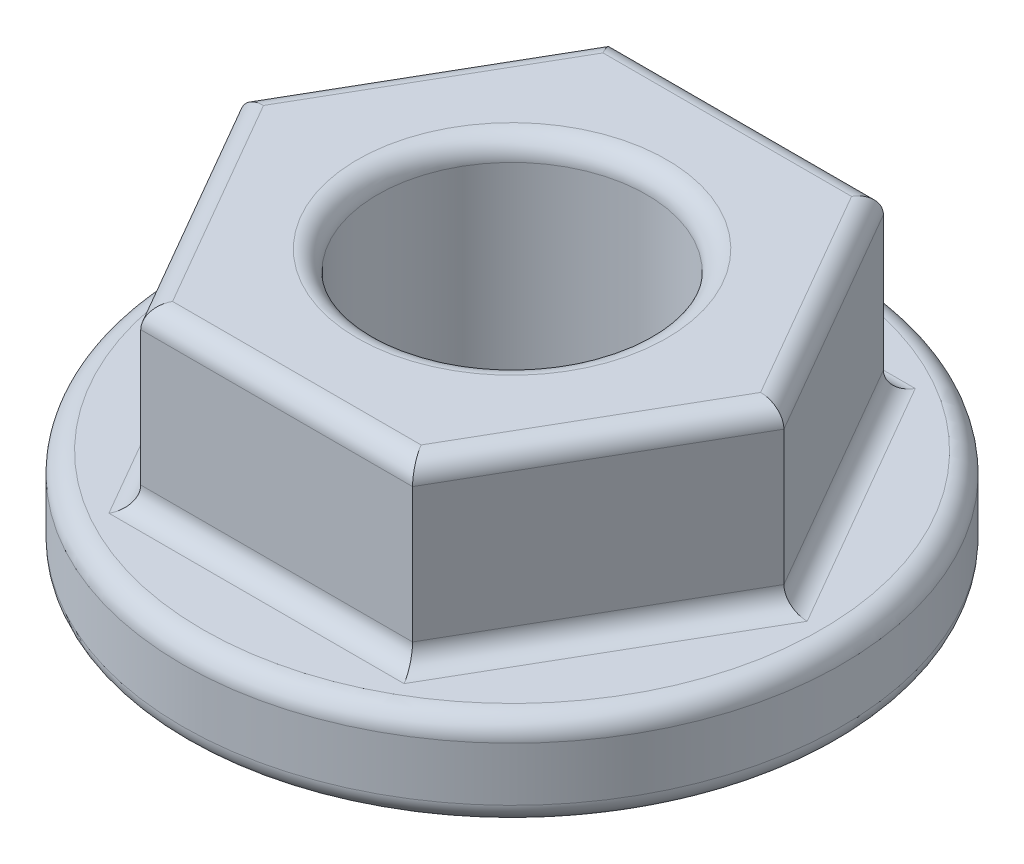
ISO-10303-21;
HEADER;
FILE_DESCRIPTION(('STEP AP214'),'2;1');
FILE_NAME('part.step','',(''),(''),'','','');
FILE_SCHEMA(('AUTOMOTIVE_DESIGN { 1 0 10303 214 1 1 1 1 }'));
ENDSEC;
DATA;
#1=APPLICATION_CONTEXT('core data for automotive mechanical design processes');
#2=APPLICATION_PROTOCOL_DEFINITION('international standard','automotive_design',2000,#1);
#3=PRODUCT_CONTEXT('',#1,'mechanical');
#4=PRODUCT('Part','Part','',(#3));
#5=PRODUCT_RELATED_PRODUCT_CATEGORY('part','',(#4));
#6=PRODUCT_DEFINITION_FORMATION('','',#4);
#7=PRODUCT_DEFINITION_CONTEXT('part definition',#1,'design');
#8=PRODUCT_DEFINITION('design','',#6,#7);
#9=PRODUCT_DEFINITION_SHAPE('','',#8);
#10=(LENGTH_UNIT() NAMED_UNIT(*) SI_UNIT(.MILLI.,.METRE.));
#11=(NAMED_UNIT(*) PLANE_ANGLE_UNIT() SI_UNIT($,.RADIAN.));
#12=(NAMED_UNIT(*) SI_UNIT($,.STERADIAN.) SOLID_ANGLE_UNIT());
#13=UNCERTAINTY_MEASURE_WITH_UNIT(LENGTH_MEASURE(1.E-05),#10,'distance_accuracy_value','');
#14=(GEOMETRIC_REPRESENTATION_CONTEXT(3) GLOBAL_UNCERTAINTY_ASSIGNED_CONTEXT((#13)) GLOBAL_UNIT_ASSIGNED_CONTEXT((#10,
#11,#12)) REPRESENTATION_CONTEXT('',''));
#15=CARTESIAN_POINT('',(0.,0.,0.));
#16=DIRECTION('',(0.,0.,1.));
#17=DIRECTION('',(1.,0.,0.));
#18=AXIS2_PLACEMENT_3D('',#15,#16,#17);
#19=CARTESIAN_POINT('',(0.,4.,0.));
#20=DIRECTION('',(0.,-1.,0.));
#21=DIRECTION('',(0.,0.,-1.));
#22=AXIS2_PLACEMENT_3D('',#19,#20,#21);
#23=CYLINDRICAL_SURFACE('',#22,4.9);
#24=CARTESIAN_POINT('',(0.,0.3,0.));
#25=DIRECTION('',(0.,1.,0.));
#26=DIRECTION('',(0.,0.,1.));
#27=AXIS2_PLACEMENT_3D('',#24,#25,#26);
#28=CIRCLE('',#27,4.9);
#29=CARTESIAN_POINT('',(0.,0.3,4.9));
#30=VERTEX_POINT('',#29);
#31=EDGE_CURVE('E251',#30,#30,#28,.T.);
#32=ORIENTED_EDGE('',*,*,#31,.T.);
#33=EDGE_LOOP('',(#32));
#34=FACE_BOUND('',#33,.T.);
#35=CARTESIAN_POINT('',(0.,1.1,0.));
#36=DIRECTION('',(0.,1.,0.));
#37=DIRECTION('',(0.,0.,1.));
#38=AXIS2_PLACEMENT_3D('',#35,#36,#37);
#39=CIRCLE('',#38,4.9);
#40=CARTESIAN_POINT('',(0.,1.1,4.9));
#41=VERTEX_POINT('',#40);
#42=EDGE_CURVE('E248',#41,#41,#39,.F.);
#43=ORIENTED_EDGE('',*,*,#42,.T.);
#44=EDGE_LOOP('',(#43));
#45=FACE_BOUND('',#44,.T.);
#46=ADVANCED_FACE('F38',(#34,#45),#23,.T.);
#47=CARTESIAN_POINT('',(0.,4.,0.));
#48=DIRECTION('',(0.,1.,0.));
#49=DIRECTION('',(0.,0.,1.));
#50=AXIS2_PLACEMENT_3D('',#47,#48,#49);
#51=PLANE('',#50);
#52=DIRECTION('',(-0.5,0.,0.866025403784439));
#53=VECTOR('',#52,1.);
#54=CARTESIAN_POINT('',(-2.77128129211021,4.,-1.6));
#55=LINE('',#54,#53);
#56=CARTESIAN_POINT('',(-1.8475208614068,4.,-3.2));
#57=VERTEX_POINT('',#56);
#58=CARTESIAN_POINT('',(-3.69504172281361,4.,0.));
#59=VERTEX_POINT('',#58);
#60=EDGE_CURVE('E47',#57,#59,#55,.T.);
#61=ORIENTED_EDGE('',*,*,#60,.T.);
#62=DIRECTION('',(0.5,0.,0.866025403784438));
#63=VECTOR('',#62,1.);
#64=CARTESIAN_POINT('',(-2.7712812921102,4.,1.6));
#65=LINE('',#64,#63);
#66=CARTESIAN_POINT('',(-1.8475208614068,4.,3.2));
#67=VERTEX_POINT('',#66);
#68=EDGE_CURVE('E12',#59,#67,#65,.T.);
#69=ORIENTED_EDGE('',*,*,#68,.T.);
#70=DIRECTION('',(1.,0.,0.));
#71=VECTOR('',#70,1.);
#72=CARTESIAN_POINT('',(0.,4.,3.2));
#73=LINE('',#72,#71);
#74=CARTESIAN_POINT('',(1.84752086140681,4.,3.2));
#75=VERTEX_POINT('',#74);
#76=EDGE_CURVE('E189',#67,#75,#73,.T.);
#77=ORIENTED_EDGE('',*,*,#76,.T.);
#78=DIRECTION('',(0.5,0.,-0.866025403784439));
#79=VECTOR('',#78,1.);
#80=CARTESIAN_POINT('',(2.77128129211021,4.,1.6));
#81=LINE('',#80,#79);
#82=CARTESIAN_POINT('',(3.69504172281361,4.,0.));
#83=VERTEX_POINT('',#82);
#84=EDGE_CURVE('E191',#75,#83,#81,.T.);
#85=ORIENTED_EDGE('',*,*,#84,.T.);
#86=DIRECTION('',(-0.5,0.,-0.866025403784439));
#87=VECTOR('',#86,1.);
#88=CARTESIAN_POINT('',(2.7712812921102,4.,-1.6));
#89=LINE('',#88,#87);
#90=CARTESIAN_POINT('',(1.8475208614068,4.,-3.2));
#91=VERTEX_POINT('',#90);
#92=EDGE_CURVE('E193',#83,#91,#89,.T.);
#93=ORIENTED_EDGE('',*,*,#92,.T.);
#94=DIRECTION('',(-1.,0.,0.));
#95=VECTOR('',#94,1.);
#96=CARTESIAN_POINT('',(0.,4.,-3.2));
#97=LINE('',#96,#95);
#98=EDGE_CURVE('E58',#91,#57,#97,.T.);
#99=ORIENTED_EDGE('',*,*,#98,.T.);
#100=EDGE_LOOP('',(#61,#69,#77,#85,#93,#99));
#101=FACE_BOUND('',#100,.T.);
#102=CARTESIAN_POINT('',(0.,4.,0.));
#103=DIRECTION('',(0.,1.,0.));
#104=DIRECTION('',(0.,0.,1.));
#105=AXIS2_PLACEMENT_3D('',#102,#103,#104);
#106=CIRCLE('',#105,2.3);
#107=CARTESIAN_POINT('',(0.,4.,2.3));
#108=VERTEX_POINT('',#107);
#109=EDGE_CURVE('E186',#108,#108,#106,.F.);
#110=ORIENTED_EDGE('',*,*,#109,.T.);
#111=EDGE_LOOP('',(#110));
#112=FACE_BOUND('',#111,.T.);
#113=ADVANCED_FACE('F326',(#101,#112),#51,.T.);
#114=CARTESIAN_POINT('',(0.,0.,0.));
#115=DIRECTION('',(0.,1.,0.));
#116=DIRECTION('',(0.,0.,1.));
#117=AXIS2_PLACEMENT_3D('',#114,#115,#116);
#118=PLANE('',#117);
#119=CARTESIAN_POINT('',(0.,0.,0.));
#120=DIRECTION('',(0.,1.,0.));
#121=DIRECTION('',(0.,0.,1.));
#122=AXIS2_PLACEMENT_3D('',#119,#120,#121);
#123=CIRCLE('',#122,4.6);
#124=CARTESIAN_POINT('',(0.,0.,4.6));
#125=VERTEX_POINT('',#124);
#126=EDGE_CURVE('E258',#125,#125,#123,.F.);
#127=ORIENTED_EDGE('',*,*,#126,.T.);
#128=EDGE_LOOP('',(#127));
#129=FACE_BOUND('',#128,.T.);
#130=CARTESIAN_POINT('',(0.,0.,0.));
#131=DIRECTION('',(0.,1.,0.));
#132=DIRECTION('',(0.,0.,1.));
#133=AXIS2_PLACEMENT_3D('',#130,#131,#132);
#134=CIRCLE('',#133,2.3);
#135=CARTESIAN_POINT('',(0.,0.,2.3));
#136=VERTEX_POINT('',#135);
#137=EDGE_CURVE('E255',#136,#136,#134,.T.);
#138=ORIENTED_EDGE('',*,*,#137,.T.);
#139=EDGE_LOOP('',(#138));
#140=FACE_BOUND('',#139,.T.);
#141=ADVANCED_FACE('F332',(#129,#140),#118,.F.);
#142=CARTESIAN_POINT('',(0.,-0.799999999999999,0.));
#143=DIRECTION('',(0.,1.,0.));
#144=DIRECTION('',(0.,0.,1.));
#145=AXIS2_PLACEMENT_3D('',#142,#143,#144);
#146=CYLINDRICAL_SURFACE('',#145,2.);
#147=CARTESIAN_POINT('',(0.,0.3,0.));
#148=DIRECTION('',(0.,1.,0.));
#149=DIRECTION('',(0.,0.,1.));
#150=AXIS2_PLACEMENT_3D('',#147,#148,#149);
#151=CIRCLE('',#150,2.);
#152=CARTESIAN_POINT('',(0.,0.3,2.));
#153=VERTEX_POINT('',#152);
#154=EDGE_CURVE('E149',#153,#153,#151,.F.);
#155=ORIENTED_EDGE('',*,*,#154,.T.);
#156=EDGE_LOOP('',(#155));
#157=FACE_BOUND('',#156,.T.);
#158=CARTESIAN_POINT('',(0.,3.7,0.));
#159=DIRECTION('',(0.,1.,0.));
#160=DIRECTION('',(0.,0.,1.));
#161=AXIS2_PLACEMENT_3D('',#158,#159,#160);
#162=CIRCLE('',#161,2.);
#163=CARTESIAN_POINT('',(0.,3.7,2.));
#164=VERTEX_POINT('',#163);
#165=EDGE_CURVE('E261',#164,#164,#162,.T.);
#166=ORIENTED_EDGE('',*,*,#165,.T.);
#167=EDGE_LOOP('',(#166));
#168=FACE_BOUND('',#167,.T.);
#169=ADVANCED_FACE('F506',(#157,#168),#146,.F.);
#170=CARTESIAN_POINT('',(0.,1.4,0.));
#171=DIRECTION('',(0.,1.,0.));
#172=DIRECTION('',(0.,0.,1.));
#173=AXIS2_PLACEMENT_3D('',#170,#171,#172);
#174=PLANE('',#173);
#175=CARTESIAN_POINT('',(0.,1.4,0.));
#176=DIRECTION('',(0.,1.,0.));
#177=DIRECTION('',(0.,0.,1.));
#178=AXIS2_PLACEMENT_3D('',#175,#176,#177);
#179=CIRCLE('',#178,4.6);
#180=CARTESIAN_POINT('',(0.,1.4,4.6));
#181=VERTEX_POINT('',#180);
#182=EDGE_CURVE('E154',#181,#181,#179,.T.);
#183=ORIENTED_EDGE('',*,*,#182,.T.);
#184=EDGE_LOOP('',(#183));
#185=FACE_BOUND('',#184,.T.);
#186=DIRECTION('',(-0.5,0.,-0.866025403784439));
#187=VECTOR('',#186,1.);
#188=CARTESIAN_POINT('',(4.30125950546271,1.4,-0.149999999999998));
#189=LINE('',#188,#187);
#190=CARTESIAN_POINT('',(2.19393102292058,1.4,-3.8));
#191=VERTEX_POINT('',#190);
#192=CARTESIAN_POINT('',(4.38786204584116,1.4,0.));
#193=VERTEX_POINT('',#192);
#194=EDGE_CURVE('E153',#191,#193,#189,.F.);
#195=ORIENTED_EDGE('',*,*,#194,.T.);
#196=DIRECTION('',(0.5,0.,-0.866025403784439));
#197=VECTOR('',#196,1.);
#198=CARTESIAN_POINT('',(2.28053356329902,1.4,3.65));
#199=LINE('',#198,#197);
#200=CARTESIAN_POINT('',(2.19393102292058,1.4,3.8));
#201=VERTEX_POINT('',#200);
#202=EDGE_CURVE('E132',#193,#201,#199,.F.);
#203=ORIENTED_EDGE('',*,*,#202,.T.);
#204=DIRECTION('',(1.,0.,0.));
#205=VECTOR('',#204,1.);
#206=CARTESIAN_POINT('',(-2.02072594216369,1.4,3.8));
#207=LINE('',#206,#205);
#208=CARTESIAN_POINT('',(-2.19393102292058,1.4,3.8));
#209=VERTEX_POINT('',#208);
#210=EDGE_CURVE('E142',#201,#209,#207,.F.);
#211=ORIENTED_EDGE('',*,*,#210,.T.);
#212=DIRECTION('',(0.5,0.,0.866025403784438));
#213=VECTOR('',#212,1.);
#214=CARTESIAN_POINT('',(-4.30125950546271,1.4,0.15));
#215=LINE('',#214,#213);
#216=CARTESIAN_POINT('',(-4.38786204584116,1.4,0.));
#217=VERTEX_POINT('',#216);
#218=EDGE_CURVE('E148',#209,#217,#215,.F.);
#219=ORIENTED_EDGE('',*,*,#218,.T.);
#220=DIRECTION('',(-0.5,0.,0.866025403784439));
#221=VECTOR('',#220,1.);
#222=CARTESIAN_POINT('',(-2.28053356329902,1.4,-3.65));
#223=LINE('',#222,#221);
#224=CARTESIAN_POINT('',(-2.19393102292058,1.4,-3.8));
#225=VERTEX_POINT('',#224);
#226=EDGE_CURVE('E267',#217,#225,#223,.F.);
#227=ORIENTED_EDGE('',*,*,#226,.T.);
#228=DIRECTION('',(-1.,0.,0.));
#229=VECTOR('',#228,1.);
#230=CARTESIAN_POINT('',(2.02072594216369,1.4,-3.8));
#231=LINE('',#230,#229);
#232=EDGE_CURVE('E159',#225,#191,#231,.F.);
#233=ORIENTED_EDGE('',*,*,#232,.T.);
#234=EDGE_LOOP('',(#195,#203,#211,#219,#227,#233));
#235=FACE_BOUND('',#234,.T.);
#236=ADVANCED_FACE('F151',(#185,#235),#174,.T.);
#237=CARTESIAN_POINT('',(2.02072594216369,1.4,3.5));
#238=DIRECTION('',(0.866025403784439,0.,0.5));
#239=DIRECTION('',(0.5,0.,-0.866025403784439));
#240=AXIS2_PLACEMENT_3D('',#237,#238,#239);
#241=PLANE('',#240);
#242=DIRECTION('',(0.,1.,0.));
#243=VECTOR('',#242,1.);
#244=CARTESIAN_POINT('',(2.02072594216369,1.4,3.5));
#245=LINE('',#244,#243);
#246=CARTESIAN_POINT('',(2.02072594216369,1.7,3.5));
#247=VERTEX_POINT('',#246);
#248=CARTESIAN_POINT('',(2.02072594216369,3.7,3.5));
#249=VERTEX_POINT('',#248);
#250=EDGE_CURVE('E252',#247,#249,#245,.T.);
#251=ORIENTED_EDGE('',*,*,#250,.F.);
#252=DIRECTION('',(0.5,0.,-0.866025403784439));
#253=VECTOR('',#252,1.);
#254=CARTESIAN_POINT('',(4.04145188432738,1.7,0.));
#255=LINE('',#254,#253);
#256=CARTESIAN_POINT('',(4.04145188432738,1.7,0.));
#257=VERTEX_POINT('',#256);
#258=EDGE_CURVE('E135',#247,#257,#255,.T.);
#259=ORIENTED_EDGE('',*,*,#258,.T.);
#260=DIRECTION('',(0.,1.,0.));
#261=VECTOR('',#260,1.);
#262=CARTESIAN_POINT('',(4.04145188432738,1.4,0.));
#263=LINE('',#262,#261);
#264=CARTESIAN_POINT('',(4.04145188432738,3.7,0.));
#265=VERTEX_POINT('',#264);
#266=EDGE_CURVE('E207',#257,#265,#263,.T.);
#267=ORIENTED_EDGE('',*,*,#266,.T.);
#268=DIRECTION('',(0.5,0.,-0.866025403784439));
#269=VECTOR('',#268,1.);
#270=CARTESIAN_POINT('',(2.02072594216369,3.7,3.5));
#271=LINE('',#270,#269);
#272=EDGE_CURVE('E157',#265,#249,#271,.F.);
#273=ORIENTED_EDGE('',*,*,#272,.T.);
#274=EDGE_LOOP('',(#251,#259,#267,#273));
#275=FACE_BOUND('',#274,.T.);
#276=ADVANCED_FACE('F241',(#275),#241,.T.);
#277=CARTESIAN_POINT('',(-2.02072594216369,1.4,3.5));
#278=DIRECTION('',(0.,0.,1.));
#279=DIRECTION('',(1.,0.,0.));
#280=AXIS2_PLACEMENT_3D('',#277,#278,#279);
#281=PLANE('',#280);
#282=DIRECTION('',(0.,1.,0.));
#283=VECTOR('',#282,1.);
#284=CARTESIAN_POINT('',(-2.02072594216369,1.4,3.5));
#285=LINE('',#284,#283);
#286=CARTESIAN_POINT('',(-2.02072594216369,1.7,3.5));
#287=VERTEX_POINT('',#286);
#288=CARTESIAN_POINT('',(-2.02072594216369,3.7,3.5));
#289=VERTEX_POINT('',#288);
#290=EDGE_CURVE('E286',#287,#289,#285,.T.);
#291=ORIENTED_EDGE('',*,*,#290,.F.);
#292=DIRECTION('',(1.,0.,0.));
#293=VECTOR('',#292,1.);
#294=CARTESIAN_POINT('',(2.02072594216369,1.7,3.5));
#295=LINE('',#294,#293);
#296=EDGE_CURVE('E184',#287,#247,#295,.T.);
#297=ORIENTED_EDGE('',*,*,#296,.T.);
#298=ORIENTED_EDGE('',*,*,#250,.T.);
#299=DIRECTION('',(1.,0.,0.));
#300=VECTOR('',#299,1.);
#301=CARTESIAN_POINT('',(-2.02072594216369,3.7,3.5));
#302=LINE('',#301,#300);
#303=EDGE_CURVE('E182',#249,#289,#302,.F.);
#304=ORIENTED_EDGE('',*,*,#303,.T.);
#305=EDGE_LOOP('',(#291,#297,#298,#304));
#306=FACE_BOUND('',#305,.T.);
#307=ADVANCED_FACE('F294',(#306),#281,.T.);
#308=CARTESIAN_POINT('',(-4.04145188432738,1.4,0.));
#309=DIRECTION('',(-0.866025403784438,0.,0.5));
#310=DIRECTION('',(0.5,0.,0.866025403784438));
#311=AXIS2_PLACEMENT_3D('',#308,#309,#310);
#312=PLANE('',#311);
#313=DIRECTION('',(0.,1.,0.));
#314=VECTOR('',#313,1.);
#315=CARTESIAN_POINT('',(-4.04145188432738,1.4,0.));
#316=LINE('',#315,#314);
#317=CARTESIAN_POINT('',(-4.04145188432738,1.7,0.));
#318=VERTEX_POINT('',#317);
#319=CARTESIAN_POINT('',(-4.04145188432738,3.7,0.));
#320=VERTEX_POINT('',#319);
#321=EDGE_CURVE('E284',#318,#320,#316,.T.);
#322=ORIENTED_EDGE('',*,*,#321,.F.);
#323=DIRECTION('',(0.5,0.,0.866025403784438));
#324=VECTOR('',#323,1.);
#325=CARTESIAN_POINT('',(-2.02072594216369,1.7,3.5));
#326=LINE('',#325,#324);
#327=EDGE_CURVE('E180',#318,#287,#326,.T.);
#328=ORIENTED_EDGE('',*,*,#327,.T.);
#329=ORIENTED_EDGE('',*,*,#290,.T.);
#330=DIRECTION('',(0.5,0.,0.866025403784438));
#331=VECTOR('',#330,1.);
#332=CARTESIAN_POINT('',(-4.04145188432738,3.7,0.));
#333=LINE('',#332,#331);
#334=EDGE_CURVE('E177',#289,#320,#333,.F.);
#335=ORIENTED_EDGE('',*,*,#334,.T.);
#336=EDGE_LOOP('',(#322,#328,#329,#335));
#337=FACE_BOUND('',#336,.T.);
#338=ADVANCED_FACE('F308',(#337),#312,.T.);
#339=CARTESIAN_POINT('',(-2.02072594216369,1.4,-3.5));
#340=DIRECTION('',(-0.866025403784439,0.,-0.5));
#341=DIRECTION('',(-0.5,0.,0.866025403784439));
#342=AXIS2_PLACEMENT_3D('',#339,#340,#341);
#343=PLANE('',#342);
#344=DIRECTION('',(0.,1.,0.));
#345=VECTOR('',#344,1.);
#346=CARTESIAN_POINT('',(-2.02072594216369,1.4,-3.5));
#347=LINE('',#346,#345);
#348=CARTESIAN_POINT('',(-2.02072594216369,1.7,-3.5));
#349=VERTEX_POINT('',#348);
#350=CARTESIAN_POINT('',(-2.02072594216369,3.7,-3.5));
#351=VERTEX_POINT('',#350);
#352=EDGE_CURVE('E244',#349,#351,#347,.T.);
#353=ORIENTED_EDGE('',*,*,#352,.F.);
#354=DIRECTION('',(-0.5,0.,0.866025403784439));
#355=VECTOR('',#354,1.);
#356=CARTESIAN_POINT('',(-4.04145188432738,1.7,0.));
#357=LINE('',#356,#355);
#358=EDGE_CURVE('E175',#349,#318,#357,.T.);
#359=ORIENTED_EDGE('',*,*,#358,.T.);
#360=ORIENTED_EDGE('',*,*,#321,.T.);
#361=DIRECTION('',(-0.5,0.,0.866025403784439));
#362=VECTOR('',#361,1.);
#363=CARTESIAN_POINT('',(-2.02072594216369,3.7,-3.5));
#364=LINE('',#363,#362);
#365=EDGE_CURVE('E173',#320,#351,#364,.F.);
#366=ORIENTED_EDGE('',*,*,#365,.T.);
#367=EDGE_LOOP('',(#353,#359,#360,#366));
#368=FACE_BOUND('',#367,.T.);
#369=ADVANCED_FACE('F310',(#368),#343,.T.);
#370=CARTESIAN_POINT('',(2.02072594216369,1.4,-3.5));
#371=DIRECTION('',(0.,0.,-1.));
#372=DIRECTION('',(-1.,0.,0.));
#373=AXIS2_PLACEMENT_3D('',#370,#371,#372);
#374=PLANE('',#373);
#375=DIRECTION('',(0.,1.,0.));
#376=VECTOR('',#375,1.);
#377=CARTESIAN_POINT('',(2.02072594216369,1.4,-3.5));
#378=LINE('',#377,#376);
#379=CARTESIAN_POINT('',(2.02072594216369,1.7,-3.5));
#380=VERTEX_POINT('',#379);
#381=CARTESIAN_POINT('',(2.02072594216369,3.7,-3.5));
#382=VERTEX_POINT('',#381);
#383=EDGE_CURVE('E238',#380,#382,#378,.T.);
#384=ORIENTED_EDGE('',*,*,#383,.F.);
#385=DIRECTION('',(-1.,0.,0.));
#386=VECTOR('',#385,1.);
#387=CARTESIAN_POINT('',(-2.02072594216369,1.7,-3.5));
#388=LINE('',#387,#386);
#389=EDGE_CURVE('E171',#380,#349,#388,.T.);
#390=ORIENTED_EDGE('',*,*,#389,.T.);
#391=ORIENTED_EDGE('',*,*,#352,.T.);
#392=DIRECTION('',(-1.,0.,0.));
#393=VECTOR('',#392,1.);
#394=CARTESIAN_POINT('',(2.02072594216369,3.7,-3.5));
#395=LINE('',#394,#393);
#396=EDGE_CURVE('E169',#351,#382,#395,.F.);
#397=ORIENTED_EDGE('',*,*,#396,.T.);
#398=EDGE_LOOP('',(#384,#390,#391,#397));
#399=FACE_BOUND('',#398,.T.);
#400=ADVANCED_FACE('F279',(#399),#374,.T.);
#401=CARTESIAN_POINT('',(4.04145188432738,1.4,0.));
#402=DIRECTION('',(0.866025403784438,0.,-0.5));
#403=DIRECTION('',(-0.5,0.,-0.866025403784439));
#404=AXIS2_PLACEMENT_3D('',#401,#402,#403);
#405=PLANE('',#404);
#406=ORIENTED_EDGE('',*,*,#266,.F.);
#407=DIRECTION('',(-0.5,0.,-0.866025403784439));
#408=VECTOR('',#407,1.);
#409=CARTESIAN_POINT('',(2.02072594216369,1.7,-3.5));
#410=LINE('',#409,#408);
#411=EDGE_CURVE('E167',#257,#380,#410,.T.);
#412=ORIENTED_EDGE('',*,*,#411,.T.);
#413=ORIENTED_EDGE('',*,*,#383,.T.);
#414=DIRECTION('',(-0.5,0.,-0.866025403784439));
#415=VECTOR('',#414,1.);
#416=CARTESIAN_POINT('',(4.04145188432738,3.7,0.));
#417=LINE('',#416,#415);
#418=EDGE_CURVE('E165',#382,#265,#417,.F.);
#419=ORIENTED_EDGE('',*,*,#418,.T.);
#420=EDGE_LOOP('',(#406,#412,#413,#419));
#421=FACE_BOUND('',#420,.T.);
#422=ADVANCED_FACE('F236',(#421),#405,.T.);
#423=CARTESIAN_POINT('',(0.,0.3,0.));
#424=DIRECTION('',(0.,1.,0.));
#425=DIRECTION('',(0.,0.,1.));
#426=AXIS2_PLACEMENT_3D('',#423,#424,#425);
#427=TOROIDAL_SURFACE('',#426,4.6,0.3);
#428=ORIENTED_EDGE('',*,*,#126,.F.);
#429=EDGE_LOOP('',(#428));
#430=FACE_BOUND('',#429,.T.);
#431=ORIENTED_EDGE('',*,*,#31,.F.);
#432=EDGE_LOOP('',(#431));
#433=FACE_BOUND('',#432,.T.);
#434=ADVANCED_FACE('F337',(#430,#433),#427,.T.);
#435=CARTESIAN_POINT('',(0.,0.3,0.));
#436=DIRECTION('',(0.,1.,0.));
#437=DIRECTION('',(0.,0.,1.));
#438=AXIS2_PLACEMENT_3D('',#435,#436,#437);
#439=TOROIDAL_SURFACE('',#438,2.3,0.3);
#440=ORIENTED_EDGE('',*,*,#154,.F.);
#441=EDGE_LOOP('',(#440));
#442=FACE_BOUND('',#441,.T.);
#443=ORIENTED_EDGE('',*,*,#137,.F.);
#444=EDGE_LOOP('',(#443));
#445=FACE_BOUND('',#444,.T.);
#446=ADVANCED_FACE('F340',(#442,#445),#439,.T.);
#447=CARTESIAN_POINT('',(0.,1.1,0.));
#448=DIRECTION('',(0.,1.,0.));
#449=DIRECTION('',(0.,0.,1.));
#450=AXIS2_PLACEMENT_3D('',#447,#448,#449);
#451=TOROIDAL_SURFACE('',#450,4.6,0.3);
#452=ORIENTED_EDGE('',*,*,#42,.F.);
#453=EDGE_LOOP('',(#452));
#454=FACE_BOUND('',#453,.T.);
#455=ORIENTED_EDGE('',*,*,#182,.F.);
#456=EDGE_LOOP('',(#455));
#457=FACE_BOUND('',#456,.T.);
#458=ADVANCED_FACE('F323',(#454,#457),#451,.T.);
#459=CARTESIAN_POINT('',(-2.28053356329902,1.7,-3.65));
#460=DIRECTION('',(0.5,0.,-0.866025403784439));
#461=DIRECTION('',(-0.866025403784439,0.,-0.5));
#462=AXIS2_PLACEMENT_3D('',#459,#460,#461);
#463=CYLINDRICAL_SURFACE('',#462,0.3);
#464=CARTESIAN_POINT('',(-2.19393102292058,1.7,-3.8));
#465=DIRECTION('',(0.866025403784439,0.,-0.5));
#466=DIRECTION('',(-0.5,0.,-0.866025403784439));
#467=AXIS2_PLACEMENT_3D('',#464,#465,#466);
#468=ELLIPSE('',#467,0.346410161513775,0.3);
#469=EDGE_CURVE('E201',#225,#349,#468,.F.);
#470=ORIENTED_EDGE('',*,*,#469,.F.);
#471=ORIENTED_EDGE('',*,*,#226,.F.);
#472=CARTESIAN_POINT('',(-4.38786204584116,1.7,0.));
#473=DIRECTION('',(0.,0.,-1.));
#474=DIRECTION('',(-1.,0.,0.));
#475=AXIS2_PLACEMENT_3D('',#472,#473,#474);
#476=ELLIPSE('',#475,0.346410161513775,0.3);
#477=EDGE_CURVE('E204',#318,#217,#476,.T.);
#478=ORIENTED_EDGE('',*,*,#477,.F.);
#479=ORIENTED_EDGE('',*,*,#358,.F.);
#480=EDGE_LOOP('',(#470,#471,#478,#479));
#481=FACE_BOUND('',#480,.T.);
#482=ADVANCED_FACE('F312',(#481),#463,.F.);
#483=CARTESIAN_POINT('',(-4.30125950546271,1.7,0.15));
#484=DIRECTION('',(-0.5,0.,-0.866025403784438));
#485=DIRECTION('',(-0.866025403784438,0.,0.5));
#486=AXIS2_PLACEMENT_3D('',#483,#484,#485);
#487=CYLINDRICAL_SURFACE('',#486,0.3);
#488=ORIENTED_EDGE('',*,*,#477,.T.);
#489=ORIENTED_EDGE('',*,*,#218,.F.);
#490=CARTESIAN_POINT('',(-2.19393102292058,1.7,3.8));
#491=DIRECTION('',(-0.866025403784439,0.,-0.5));
#492=DIRECTION('',(-0.5,0.,0.866025403784439));
#493=AXIS2_PLACEMENT_3D('',#490,#491,#492);
#494=ELLIPSE('',#493,0.346410161513775,0.3);
#495=EDGE_CURVE('E145',#287,#209,#494,.T.);
#496=ORIENTED_EDGE('',*,*,#495,.F.);
#497=ORIENTED_EDGE('',*,*,#327,.F.);
#498=EDGE_LOOP('',(#488,#489,#496,#497));
#499=FACE_BOUND('',#498,.T.);
#500=ADVANCED_FACE('F315',(#499),#487,.F.);
#501=CARTESIAN_POINT('',(2.02072594216369,1.7,-3.8));
#502=DIRECTION('',(1.,0.,0.));
#503=DIRECTION('',(0.,0.,-1.));
#504=AXIS2_PLACEMENT_3D('',#501,#502,#503);
#505=CYLINDRICAL_SURFACE('',#504,0.3);
#506=ORIENTED_EDGE('',*,*,#469,.T.);
#507=ORIENTED_EDGE('',*,*,#389,.F.);
#508=CARTESIAN_POINT('',(2.19393102292058,1.7,-3.8));
#509=DIRECTION('',(0.866025403784439,0.,0.5));
#510=DIRECTION('',(0.5,0.,-0.866025403784439));
#511=AXIS2_PLACEMENT_3D('',#508,#509,#510);
#512=ELLIPSE('',#511,0.346410161513775,0.3);
#513=EDGE_CURVE('E138',#191,#380,#512,.F.);
#514=ORIENTED_EDGE('',*,*,#513,.F.);
#515=ORIENTED_EDGE('',*,*,#232,.F.);
#516=EDGE_LOOP('',(#506,#507,#514,#515));
#517=FACE_BOUND('',#516,.T.);
#518=ADVANCED_FACE('F274',(#517),#505,.F.);
#519=CARTESIAN_POINT('',(-2.02072594216369,1.7,3.8));
#520=DIRECTION('',(-1.,0.,0.));
#521=DIRECTION('',(0.,0.,1.));
#522=AXIS2_PLACEMENT_3D('',#519,#520,#521);
#523=CYLINDRICAL_SURFACE('',#522,0.3);
#524=ORIENTED_EDGE('',*,*,#495,.T.);
#525=ORIENTED_EDGE('',*,*,#210,.F.);
#526=CARTESIAN_POINT('',(2.19393102292058,1.7,3.8));
#527=DIRECTION('',(-0.866025403784439,0.,0.5));
#528=DIRECTION('',(-0.5,0.,-0.866025403784439));
#529=AXIS2_PLACEMENT_3D('',#526,#527,#528);
#530=ELLIPSE('',#529,0.346410161513775,0.3);
#531=EDGE_CURVE('E128',#247,#201,#530,.T.);
#532=ORIENTED_EDGE('',*,*,#531,.F.);
#533=ORIENTED_EDGE('',*,*,#296,.F.);
#534=EDGE_LOOP('',(#524,#525,#532,#533));
#535=FACE_BOUND('',#534,.T.);
#536=ADVANCED_FACE('F143',(#535),#523,.F.);
#537=CARTESIAN_POINT('',(4.30125950546271,1.7,-0.149999999999998));
#538=DIRECTION('',(0.5,0.,0.866025403784439));
#539=DIRECTION('',(0.866025403784438,0.,-0.5));
#540=AXIS2_PLACEMENT_3D('',#537,#538,#539);
#541=CYLINDRICAL_SURFACE('',#540,0.3);
#542=ORIENTED_EDGE('',*,*,#513,.T.);
#543=ORIENTED_EDGE('',*,*,#411,.F.);
#544=CARTESIAN_POINT('',(4.38786204584116,1.7,0.));
#545=DIRECTION('',(0.,0.,1.));
#546=DIRECTION('',(1.,0.,0.));
#547=AXIS2_PLACEMENT_3D('',#544,#545,#546);
#548=ELLIPSE('',#547,0.346410161513775,0.3);
#549=EDGE_CURVE('E139',#193,#257,#548,.F.);
#550=ORIENTED_EDGE('',*,*,#549,.F.);
#551=ORIENTED_EDGE('',*,*,#194,.F.);
#552=EDGE_LOOP('',(#542,#543,#550,#551));
#553=FACE_BOUND('',#552,.T.);
#554=ADVANCED_FACE('F277',(#553),#541,.F.);
#555=CARTESIAN_POINT('',(2.28053356329902,1.7,3.65));
#556=DIRECTION('',(-0.5,0.,0.866025403784439));
#557=DIRECTION('',(0.866025403784439,0.,0.5));
#558=AXIS2_PLACEMENT_3D('',#555,#556,#557);
#559=CYLINDRICAL_SURFACE('',#558,0.3);
#560=ORIENTED_EDGE('',*,*,#531,.T.);
#561=ORIENTED_EDGE('',*,*,#202,.F.);
#562=ORIENTED_EDGE('',*,*,#549,.T.);
#563=ORIENTED_EDGE('',*,*,#258,.F.);
#564=EDGE_LOOP('',(#560,#561,#562,#563));
#565=FACE_BOUND('',#564,.T.);
#566=ADVANCED_FACE('F130',(#565),#559,.F.);
#567=CARTESIAN_POINT('',(2.7712812921102,3.7,-1.6));
#568=DIRECTION('',(-0.5,0.,-0.866025403784439));
#569=DIRECTION('',(-0.866025403784438,0.,0.5));
#570=AXIS2_PLACEMENT_3D('',#567,#568,#569);
#571=CYLINDRICAL_SURFACE('',#570,0.3);
#572=CARTESIAN_POINT('',(3.69504172281361,3.7,0.));
#573=DIRECTION('',(0.,0.,-1.));
#574=DIRECTION('',(1.,0.,0.));
#575=AXIS2_PLACEMENT_3D('',#572,#573,#574);
#576=ELLIPSE('',#575,0.346410161513775,0.3);
#577=EDGE_CURVE('E217',#265,#83,#576,.F.);
#578=ORIENTED_EDGE('',*,*,#577,.F.);
#579=ORIENTED_EDGE('',*,*,#418,.F.);
#580=CARTESIAN_POINT('',(1.8475208614068,3.7,-3.2));
#581=DIRECTION('',(-0.866025403784439,0.,-0.5));
#582=DIRECTION('',(0.5,0.,-0.866025403784439));
#583=AXIS2_PLACEMENT_3D('',#580,#581,#582);
#584=ELLIPSE('',#583,0.346410161513775,0.3);
#585=EDGE_CURVE('E42',#91,#382,#584,.T.);
#586=ORIENTED_EDGE('',*,*,#585,.F.);
#587=ORIENTED_EDGE('',*,*,#92,.F.);
#588=EDGE_LOOP('',(#578,#579,#586,#587));
#589=FACE_BOUND('',#588,.T.);
#590=ADVANCED_FACE('F231',(#589),#571,.T.);
#591=CARTESIAN_POINT('',(0.,3.7,-3.2));
#592=DIRECTION('',(-1.,0.,0.));
#593=DIRECTION('',(0.,0.,1.));
#594=AXIS2_PLACEMENT_3D('',#591,#592,#593);
#595=CYLINDRICAL_SURFACE('',#594,0.3);
#596=ORIENTED_EDGE('',*,*,#585,.T.);
#597=ORIENTED_EDGE('',*,*,#396,.F.);
#598=CARTESIAN_POINT('',(-1.8475208614068,3.7,-3.2));
#599=DIRECTION('',(-0.866025403784439,0.,0.5));
#600=DIRECTION('',(-0.5,0.,-0.866025403784439));
#601=AXIS2_PLACEMENT_3D('',#598,#599,#600);
#602=ELLIPSE('',#601,0.346410161513775,0.3);
#603=EDGE_CURVE('E215',#57,#351,#602,.T.);
#604=ORIENTED_EDGE('',*,*,#603,.F.);
#605=ORIENTED_EDGE('',*,*,#98,.F.);
#606=EDGE_LOOP('',(#596,#597,#604,#605));
#607=FACE_BOUND('',#606,.T.);
#608=ADVANCED_FACE('F227',(#607),#595,.T.);
#609=CARTESIAN_POINT('',(2.77128129211021,3.7,1.6));
#610=DIRECTION('',(0.5,0.,-0.866025403784439));
#611=DIRECTION('',(-0.866025403784439,0.,-0.5));
#612=AXIS2_PLACEMENT_3D('',#609,#610,#611);
#613=CYLINDRICAL_SURFACE('',#612,0.3);
#614=ORIENTED_EDGE('',*,*,#577,.T.);
#615=ORIENTED_EDGE('',*,*,#84,.F.);
#616=CARTESIAN_POINT('',(1.8475208614068,3.7,3.2));
#617=DIRECTION('',(0.866025403784439,0.,-0.5));
#618=DIRECTION('',(0.5,0.,0.866025403784439));
#619=AXIS2_PLACEMENT_3D('',#616,#617,#618);
#620=ELLIPSE('',#619,0.346410161513775,0.3);
#621=EDGE_CURVE('E212',#249,#75,#620,.F.);
#622=ORIENTED_EDGE('',*,*,#621,.F.);
#623=ORIENTED_EDGE('',*,*,#272,.F.);
#624=EDGE_LOOP('',(#614,#615,#622,#623));
#625=FACE_BOUND('',#624,.T.);
#626=ADVANCED_FACE('F296',(#625),#613,.T.);
#627=CARTESIAN_POINT('',(-2.7712812921102,3.7,-1.6));
#628=DIRECTION('',(-0.5,0.,0.866025403784439));
#629=DIRECTION('',(0.866025403784439,0.,0.5));
#630=AXIS2_PLACEMENT_3D('',#627,#628,#629);
#631=CYLINDRICAL_SURFACE('',#630,0.3);
#632=ORIENTED_EDGE('',*,*,#603,.T.);
#633=ORIENTED_EDGE('',*,*,#365,.F.);
#634=CARTESIAN_POINT('',(-3.69504172281361,3.7,0.));
#635=DIRECTION('',(0.,0.,1.));
#636=DIRECTION('',(-1.,0.,0.));
#637=AXIS2_PLACEMENT_3D('',#634,#635,#636);
#638=ELLIPSE('',#637,0.346410161513775,0.3);
#639=EDGE_CURVE('E210',#59,#320,#638,.T.);
#640=ORIENTED_EDGE('',*,*,#639,.F.);
#641=ORIENTED_EDGE('',*,*,#60,.F.);
#642=EDGE_LOOP('',(#632,#633,#640,#641));
#643=FACE_BOUND('',#642,.T.);
#644=ADVANCED_FACE('F382',(#643),#631,.T.);
#645=CARTESIAN_POINT('',(0.,3.7,3.2));
#646=DIRECTION('',(1.,0.,0.));
#647=DIRECTION('',(0.,0.,-1.));
#648=AXIS2_PLACEMENT_3D('',#645,#646,#647);
#649=CYLINDRICAL_SURFACE('',#648,0.3);
#650=ORIENTED_EDGE('',*,*,#621,.T.);
#651=ORIENTED_EDGE('',*,*,#76,.F.);
#652=CARTESIAN_POINT('',(-1.8475208614068,3.7,3.2));
#653=DIRECTION('',(0.866025403784439,0.,0.5));
#654=DIRECTION('',(0.5,0.,-0.866025403784439));
#655=AXIS2_PLACEMENT_3D('',#652,#653,#654);
#656=ELLIPSE('',#655,0.346410161513775,0.3);
#657=EDGE_CURVE('E208',#289,#67,#656,.F.);
#658=ORIENTED_EDGE('',*,*,#657,.F.);
#659=ORIENTED_EDGE('',*,*,#303,.F.);
#660=EDGE_LOOP('',(#650,#651,#658,#659));
#661=FACE_BOUND('',#660,.T.);
#662=ADVANCED_FACE('F300',(#661),#649,.T.);
#663=CARTESIAN_POINT('',(-2.7712812921102,3.7,1.6));
#664=DIRECTION('',(0.5,0.,0.866025403784438));
#665=DIRECTION('',(0.866025403784438,0.,-0.5));
#666=AXIS2_PLACEMENT_3D('',#663,#664,#665);
#667=CYLINDRICAL_SURFACE('',#666,0.3);
#668=ORIENTED_EDGE('',*,*,#639,.T.);
#669=ORIENTED_EDGE('',*,*,#334,.F.);
#670=ORIENTED_EDGE('',*,*,#657,.T.);
#671=ORIENTED_EDGE('',*,*,#68,.F.);
#672=EDGE_LOOP('',(#668,#669,#670,#671));
#673=FACE_BOUND('',#672,.T.);
#674=ADVANCED_FACE('F304',(#673),#667,.T.);
#675=CARTESIAN_POINT('',(0.,3.7,0.));
#676=DIRECTION('',(0.,1.,0.));
#677=DIRECTION('',(0.,0.,1.));
#678=AXIS2_PLACEMENT_3D('',#675,#676,#677);
#679=TOROIDAL_SURFACE('',#678,2.3,0.3);
#680=ORIENTED_EDGE('',*,*,#109,.F.);
#681=EDGE_LOOP('',(#680));
#682=FACE_BOUND('',#681,.T.);
#683=ORIENTED_EDGE('',*,*,#165,.F.);
#684=EDGE_LOOP('',(#683));
#685=FACE_BOUND('',#684,.T.);
#686=ADVANCED_FACE('F40',(#682,#685),#679,.T.);
#687=CLOSED_SHELL('',(#46,#113,#141,#169,#236,#276,#307,#338,#369,#400,#422,#434,#446,#458,#482,
#500,#518,#536,#554,#566,#590,#608,#626,#644,#662,#674,#686));
#688=MANIFOLD_SOLID_BREP('B2',#687);
#689=ADVANCED_BREP_SHAPE_REPRESENTATION('',(#18,#688),#14);
#690=SHAPE_DEFINITION_REPRESENTATION(#9,#689);
ENDSEC;
END-ISO-10303-21;
